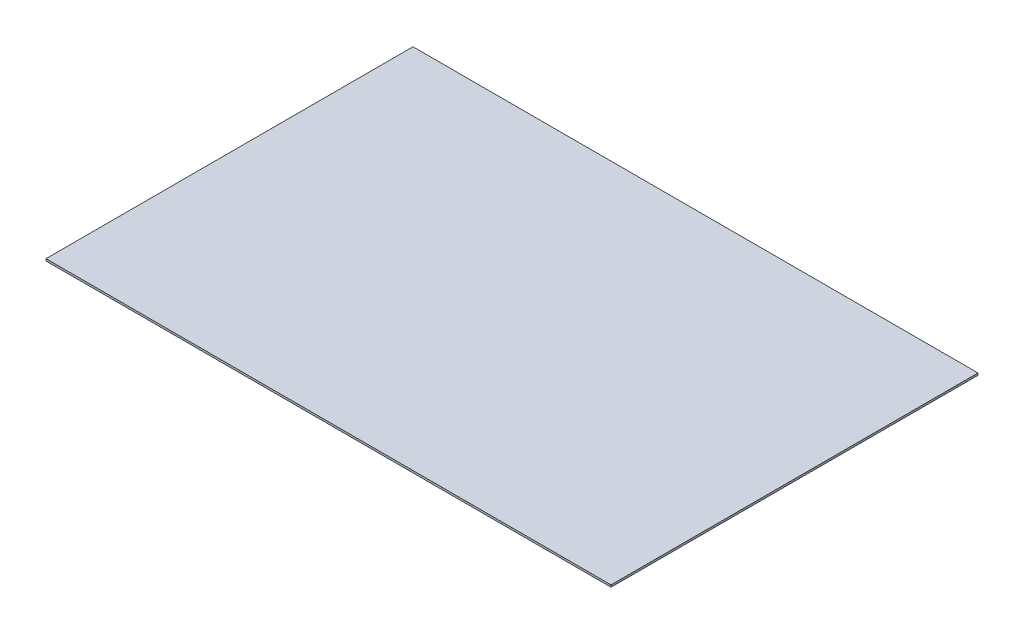
ISO-10303-21;
HEADER;
FILE_DESCRIPTION(('STEP AP214'),'2;1');
FILE_NAME('part.step','',(''),(''),'','','');
FILE_SCHEMA(('AUTOMOTIVE_DESIGN { 1 0 10303 214 1 1 1 1 }'));
ENDSEC;
DATA;
#1=APPLICATION_CONTEXT('core data for automotive mechanical design processes');
#2=APPLICATION_PROTOCOL_DEFINITION('international standard','automotive_design',2000,#1);
#3=PRODUCT_CONTEXT('',#1,'mechanical');
#4=PRODUCT('Part','Part','',(#3));
#5=PRODUCT_RELATED_PRODUCT_CATEGORY('part','',(#4));
#6=PRODUCT_DEFINITION_FORMATION('','',#4);
#7=PRODUCT_DEFINITION_CONTEXT('part definition',#1,'design');
#8=PRODUCT_DEFINITION('design','',#6,#7);
#9=PRODUCT_DEFINITION_SHAPE('','',#8);
#10=(LENGTH_UNIT() NAMED_UNIT(*) SI_UNIT(.MILLI.,.METRE.));
#11=(NAMED_UNIT(*) PLANE_ANGLE_UNIT() SI_UNIT($,.RADIAN.));
#12=(NAMED_UNIT(*) SI_UNIT($,.STERADIAN.) SOLID_ANGLE_UNIT());
#13=UNCERTAINTY_MEASURE_WITH_UNIT(LENGTH_MEASURE(1.E-05),#10,'distance_accuracy_value','');
#14=(GEOMETRIC_REPRESENTATION_CONTEXT(3) GLOBAL_UNCERTAINTY_ASSIGNED_CONTEXT((#13)) GLOBAL_UNIT_ASSIGNED_CONTEXT((#10,
#11,#12)) REPRESENTATION_CONTEXT('',''));
#15=CARTESIAN_POINT('',(0.,0.,0.));
#16=DIRECTION('',(0.,0.,1.));
#17=DIRECTION('',(1.,0.,0.));
#18=AXIS2_PLACEMENT_3D('',#15,#16,#17);
#19=CARTESIAN_POINT('',(-37.32,0.00600000000002,-25.12));
#20=DIRECTION('',(0.,1.,0.));
#21=DIRECTION('',(0.,0.,1.));
#22=AXIS2_PLACEMENT_3D('',#19,#20,#21);
#23=PLANE('',#22);
#24=DIRECTION('',(-1.,0.,0.));
#25=VECTOR('',#24,1.);
#26=CARTESIAN_POINT('',(37.32,0.00600000000006,19.32));
#27=LINE('',#26,#25);
#28=CARTESIAN_POINT('',(31.1,0.00600000000005,19.32));
#29=VERTEX_POINT('',#28);
#30=CARTESIAN_POINT('',(-31.1,0.00600000000004,19.32));
#31=VERTEX_POINT('',#30);
#32=EDGE_CURVE('E79',#29,#31,#27,.T.);
#33=ORIENTED_EDGE('',*,*,#32,.T.);
#34=DIRECTION('',(0.,0.,-1.));
#35=VECTOR('',#34,1.);
#36=CARTESIAN_POINT('',(-31.1,0.00600000000006,23.36));
#37=LINE('',#36,#35);
#38=CARTESIAN_POINT('',(-31.1,0.00600000000004,-21.08));
#39=VERTEX_POINT('',#38);
#40=EDGE_CURVE('E54',#31,#39,#37,.T.);
#41=ORIENTED_EDGE('',*,*,#40,.T.);
#42=DIRECTION('',(1.,0.,0.));
#43=VECTOR('',#42,1.);
#44=CARTESIAN_POINT('',(-37.32,0.00600000000006,-21.08));
#45=LINE('',#44,#43);
#46=CARTESIAN_POINT('',(31.1,0.00600000000004,-21.08));
#47=VERTEX_POINT('',#46);
#48=EDGE_CURVE('E56',#39,#47,#45,.T.);
#49=ORIENTED_EDGE('',*,*,#48,.T.);
#50=DIRECTION('',(0.,0.,1.));
#51=VECTOR('',#50,1.);
#52=CARTESIAN_POINT('',(31.1,0.00600000000006,-25.12));
#53=LINE('',#52,#51);
#54=EDGE_CURVE('E19',#47,#29,#53,.T.);
#55=ORIENTED_EDGE('',*,*,#54,.T.);
#56=EDGE_LOOP('',(#33,#41,#49,#55));
#57=FACE_BOUND('',#56,.T.);
#58=ADVANCED_FACE('F16',(#57),#23,.F.);
#59=CARTESIAN_POINT('',(31.1,-0.0166,-25.12));
#60=DIRECTION('',(-1.,0.,0.));
#61=DIRECTION('',(0.,0.,1.));
#62=AXIS2_PLACEMENT_3D('',#59,#60,#61);
#63=PLANE('',#62);
#64=DIRECTION('',(0.,1.,0.));
#65=VECTOR('',#64,1.);
#66=CARTESIAN_POINT('',(31.1,-0.0166,19.32));
#67=LINE('',#66,#65);
#68=CARTESIAN_POINT('',(31.1,0.232,19.32));
#69=VERTEX_POINT('',#68);
#70=EDGE_CURVE('E67',#69,#29,#67,.F.);
#71=ORIENTED_EDGE('',*,*,#70,.T.);
#72=ORIENTED_EDGE('',*,*,#54,.F.);
#73=DIRECTION('',(0.,1.,0.));
#74=VECTOR('',#73,1.);
#75=CARTESIAN_POINT('',(31.1,-0.0166,-21.08));
#76=LINE('',#75,#74);
#77=CARTESIAN_POINT('',(31.1,0.232,-21.08));
#78=VERTEX_POINT('',#77);
#79=EDGE_CURVE('E62',#47,#78,#76,.T.);
#80=ORIENTED_EDGE('',*,*,#79,.T.);
#81=DIRECTION('',(0.,0.,1.));
#82=VECTOR('',#81,1.);
#83=CARTESIAN_POINT('',(31.1,0.232,-25.12));
#84=LINE('',#83,#82);
#85=EDGE_CURVE('E82',#69,#78,#84,.F.);
#86=ORIENTED_EDGE('',*,*,#85,.F.);
#87=EDGE_LOOP('',(#71,#72,#80,#86));
#88=FACE_BOUND('',#87,.T.);
#89=ADVANCED_FACE('F64',(#88),#63,.F.);
#90=CARTESIAN_POINT('',(-37.32,-0.0166,-21.08));
#91=DIRECTION('',(0.,0.,1.));
#92=DIRECTION('',(1.,0.,0.));
#93=AXIS2_PLACEMENT_3D('',#90,#91,#92);
#94=PLANE('',#93);
#95=ORIENTED_EDGE('',*,*,#79,.F.);
#96=ORIENTED_EDGE('',*,*,#48,.F.);
#97=DIRECTION('',(0.,1.,0.));
#98=VECTOR('',#97,1.);
#99=CARTESIAN_POINT('',(-31.1,-0.0166,-21.08));
#100=LINE('',#99,#98);
#101=CARTESIAN_POINT('',(-31.1,0.232,-21.08));
#102=VERTEX_POINT('',#101);
#103=EDGE_CURVE('E74',#39,#102,#100,.T.);
#104=ORIENTED_EDGE('',*,*,#103,.T.);
#105=DIRECTION('',(1.,0.,0.));
#106=VECTOR('',#105,1.);
#107=CARTESIAN_POINT('',(-37.32,0.232,-21.08));
#108=LINE('',#107,#106);
#109=EDGE_CURVE('E71',#78,#102,#108,.F.);
#110=ORIENTED_EDGE('',*,*,#109,.F.);
#111=EDGE_LOOP('',(#95,#96,#104,#110));
#112=FACE_BOUND('',#111,.T.);
#113=ADVANCED_FACE('F69',(#112),#94,.F.);
#114=CARTESIAN_POINT('',(-31.1,-0.0166,23.36));
#115=DIRECTION('',(1.,0.,0.));
#116=DIRECTION('',(0.,0.,-1.));
#117=AXIS2_PLACEMENT_3D('',#114,#115,#116);
#118=PLANE('',#117);
#119=ORIENTED_EDGE('',*,*,#103,.F.);
#120=ORIENTED_EDGE('',*,*,#40,.F.);
#121=DIRECTION('',(0.,1.,0.));
#122=VECTOR('',#121,1.);
#123=CARTESIAN_POINT('',(-31.1,-0.0166,19.32));
#124=LINE('',#123,#122);
#125=CARTESIAN_POINT('',(-31.1,0.232,19.32));
#126=VERTEX_POINT('',#125);
#127=EDGE_CURVE('E34',#31,#126,#124,.T.);
#128=ORIENTED_EDGE('',*,*,#127,.T.);
#129=DIRECTION('',(0.,0.,1.));
#130=VECTOR('',#129,1.);
#131=CARTESIAN_POINT('',(-31.1,0.232,-25.12));
#132=LINE('',#131,#130);
#133=EDGE_CURVE('E25',#102,#126,#132,.T.);
#134=ORIENTED_EDGE('',*,*,#133,.F.);
#135=EDGE_LOOP('',(#119,#120,#128,#134));
#136=FACE_BOUND('',#135,.T.);
#137=ADVANCED_FACE('F88',(#136),#118,.F.);
#138=CARTESIAN_POINT('',(37.32,-0.0166,19.32));
#139=DIRECTION('',(0.,0.,-1.));
#140=DIRECTION('',(-1.,0.,0.));
#141=AXIS2_PLACEMENT_3D('',#138,#139,#140);
#142=PLANE('',#141);
#143=ORIENTED_EDGE('',*,*,#127,.F.);
#144=ORIENTED_EDGE('',*,*,#32,.F.);
#145=ORIENTED_EDGE('',*,*,#70,.F.);
#146=DIRECTION('',(1.,0.,0.));
#147=VECTOR('',#146,1.);
#148=CARTESIAN_POINT('',(-37.32,0.232,19.32));
#149=LINE('',#148,#147);
#150=EDGE_CURVE('E11',#126,#69,#149,.T.);
#151=ORIENTED_EDGE('',*,*,#150,.F.);
#152=EDGE_LOOP('',(#143,#144,#145,#151));
#153=FACE_BOUND('',#152,.T.);
#154=ADVANCED_FACE('F90',(#153),#142,.F.);
#155=CARTESIAN_POINT('',(-37.32,0.232,-25.12));
#156=DIRECTION('',(0.,1.,0.));
#157=DIRECTION('',(0.,0.,1.));
#158=AXIS2_PLACEMENT_3D('',#155,#156,#157);
#159=PLANE('',#158);
#160=ORIENTED_EDGE('',*,*,#133,.T.);
#161=ORIENTED_EDGE('',*,*,#150,.T.);
#162=ORIENTED_EDGE('',*,*,#85,.T.);
#163=ORIENTED_EDGE('',*,*,#109,.T.);
#164=EDGE_LOOP('',(#160,#161,#162,#163));
#165=FACE_BOUND('',#164,.T.);
#166=ADVANCED_FACE('F87',(#165),#159,.T.);
#167=CLOSED_SHELL('',(#58,#89,#113,#137,#154,#166));
#168=MANIFOLD_SOLID_BREP('B1',#167);
#169=ADVANCED_BREP_SHAPE_REPRESENTATION('',(#18,#168),#14);
#170=SHAPE_DEFINITION_REPRESENTATION(#9,#169);
ENDSEC;
END-ISO-10303-21;
